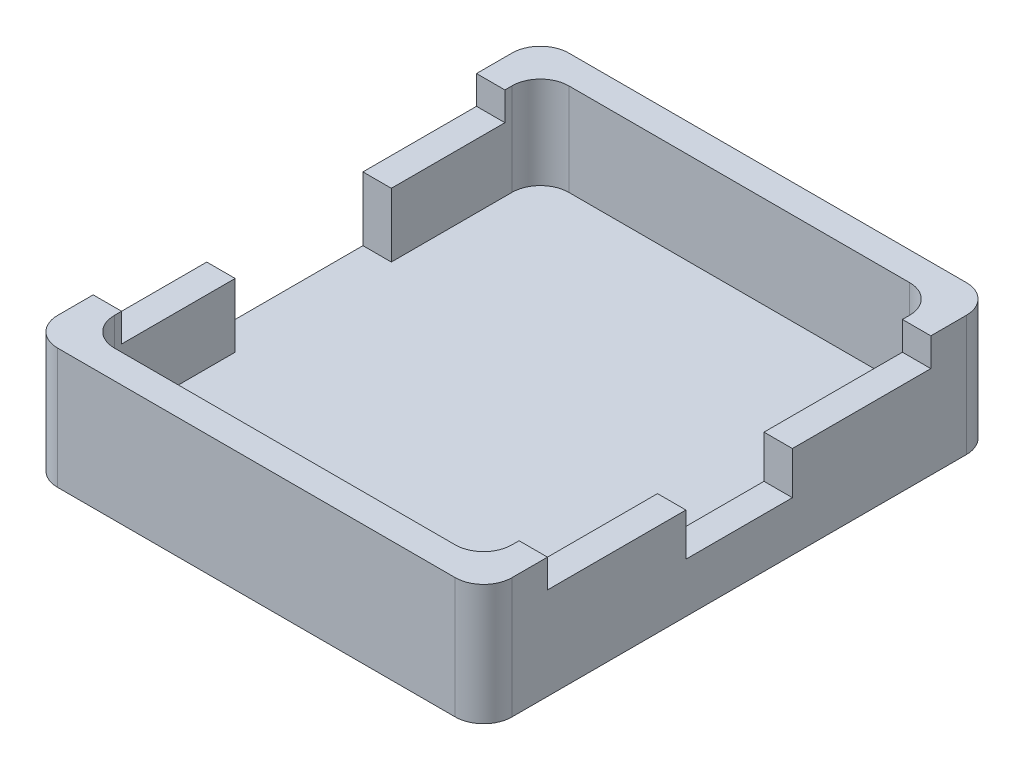
ISO-10303-21;
HEADER;
FILE_DESCRIPTION(('STEP AP214'),'2;1');
FILE_NAME('part.step','',(''),(''),'','','');
FILE_SCHEMA(('AUTOMOTIVE_DESIGN { 1 0 10303 214 1 1 1 1 }'));
ENDSEC;
DATA;
#1=APPLICATION_CONTEXT('core data for automotive mechanical design processes');
#2=APPLICATION_PROTOCOL_DEFINITION('international standard','automotive_design',2000,#1);
#3=PRODUCT_CONTEXT('',#1,'mechanical');
#4=PRODUCT('Part','Part','',(#3));
#5=PRODUCT_RELATED_PRODUCT_CATEGORY('part','',(#4));
#6=PRODUCT_DEFINITION_FORMATION('','',#4);
#7=PRODUCT_DEFINITION_CONTEXT('part definition',#1,'design');
#8=PRODUCT_DEFINITION('design','',#6,#7);
#9=PRODUCT_DEFINITION_SHAPE('','',#8);
#10=(LENGTH_UNIT() NAMED_UNIT(*) SI_UNIT(.MILLI.,.METRE.));
#11=(NAMED_UNIT(*) PLANE_ANGLE_UNIT() SI_UNIT($,.RADIAN.));
#12=(NAMED_UNIT(*) SI_UNIT($,.STERADIAN.) SOLID_ANGLE_UNIT());
#13=UNCERTAINTY_MEASURE_WITH_UNIT(LENGTH_MEASURE(1.E-05),#10,'distance_accuracy_value','');
#14=(GEOMETRIC_REPRESENTATION_CONTEXT(3) GLOBAL_UNCERTAINTY_ASSIGNED_CONTEXT((#13)) GLOBAL_UNIT_ASSIGNED_CONTEXT((#10,
#11,#12)) REPRESENTATION_CONTEXT('',''));
#15=CARTESIAN_POINT('',(0.,0.,0.));
#16=DIRECTION('',(0.,0.,1.));
#17=DIRECTION('',(1.,0.,0.));
#18=AXIS2_PLACEMENT_3D('',#15,#16,#17);
#19=CARTESIAN_POINT('',(0.,8.5,0.));
#20=DIRECTION('',(0.,1.,0.));
#21=DIRECTION('',(0.,0.,1.));
#22=AXIS2_PLACEMENT_3D('',#19,#20,#21);
#23=PLANE('',#22);
#24=DIRECTION('',(0.,0.,1.));
#25=VECTOR('',#24,1.);
#26=CARTESIAN_POINT('',(-16.,8.5,0.));
#27=LINE('',#26,#25);
#28=CARTESIAN_POINT('',(-16.,8.5,13.5));
#29=VERTEX_POINT('',#28);
#30=CARTESIAN_POINT('',(-16.,8.5,16.));
#31=VERTEX_POINT('',#30);
#32=EDGE_CURVE('E434',#29,#31,#27,.T.);
#33=ORIENTED_EDGE('',*,*,#32,.T.);
#34=CARTESIAN_POINT('',(-14.,8.5,16.));
#35=DIRECTION('',(0.,1.,0.));
#36=DIRECTION('',(0.,0.,1.));
#37=AXIS2_PLACEMENT_3D('',#34,#35,#36);
#38=CIRCLE('',#37,2.);
#39=CARTESIAN_POINT('',(-14.,8.5,18.));
#40=VERTEX_POINT('',#39);
#41=EDGE_CURVE('E536',#31,#40,#38,.T.);
#42=ORIENTED_EDGE('',*,*,#41,.T.);
#43=DIRECTION('',(1.,0.,0.));
#44=VECTOR('',#43,1.);
#45=CARTESIAN_POINT('',(0.,8.5,18.));
#46=LINE('',#45,#44);
#47=CARTESIAN_POINT('',(14.,8.5,18.));
#48=VERTEX_POINT('',#47);
#49=EDGE_CURVE('E423',#40,#48,#46,.T.);
#50=ORIENTED_EDGE('',*,*,#49,.T.);
#51=CARTESIAN_POINT('',(14.,8.5,16.));
#52=DIRECTION('',(0.,1.,0.));
#53=DIRECTION('',(0.,0.,1.));
#54=AXIS2_PLACEMENT_3D('',#51,#52,#53);
#55=CIRCLE('',#54,2.);
#56=CARTESIAN_POINT('',(16.,8.5,16.));
#57=VERTEX_POINT('',#56);
#58=EDGE_CURVE('E533',#48,#57,#55,.T.);
#59=ORIENTED_EDGE('',*,*,#58,.T.);
#60=DIRECTION('',(0.,0.,-1.));
#61=VECTOR('',#60,1.);
#62=CARTESIAN_POINT('',(16.,8.5,0.));
#63=LINE('',#62,#61);
#64=CARTESIAN_POINT('',(16.,8.5,13.5));
#65=VERTEX_POINT('',#64);
#66=EDGE_CURVE('E428',#57,#65,#63,.T.);
#67=ORIENTED_EDGE('',*,*,#66,.T.);
#68=DIRECTION('',(1.,0.,0.));
#69=VECTOR('',#68,1.);
#70=CARTESIAN_POINT('',(-13.459060435492,8.5,13.5));
#71=LINE('',#70,#69);
#72=CARTESIAN_POINT('',(14.,8.5,13.5));
#73=VERTEX_POINT('',#72);
#74=EDGE_CURVE('E322',#73,#65,#71,.T.);
#75=ORIENTED_EDGE('',*,*,#74,.F.);
#76=DIRECTION('',(0.,0.,-1.));
#77=VECTOR('',#76,1.);
#78=CARTESIAN_POINT('',(14.,8.5,0.));
#79=LINE('',#78,#77);
#80=CARTESIAN_POINT('',(14.,8.5,14.));
#81=VERTEX_POINT('',#80);
#82=EDGE_CURVE('E285',#81,#73,#79,.T.);
#83=ORIENTED_EDGE('',*,*,#82,.F.);
#84=CARTESIAN_POINT('',(12.,8.5,14.));
#85=DIRECTION('',(0.,1.,0.));
#86=DIRECTION('',(0.,0.,1.));
#87=AXIS2_PLACEMENT_3D('',#84,#85,#86);
#88=CIRCLE('',#87,2.);
#89=CARTESIAN_POINT('',(12.,8.5,16.));
#90=VERTEX_POINT('',#89);
#91=EDGE_CURVE('E11',#81,#90,#88,.F.);
#92=ORIENTED_EDGE('',*,*,#91,.T.);
#93=DIRECTION('',(1.,0.,0.));
#94=VECTOR('',#93,1.);
#95=CARTESIAN_POINT('',(0.,8.5,16.));
#96=LINE('',#95,#94);
#97=CARTESIAN_POINT('',(-12.,8.5,16.));
#98=VERTEX_POINT('',#97);
#99=EDGE_CURVE('E410',#98,#90,#96,.T.);
#100=ORIENTED_EDGE('',*,*,#99,.F.);
#101=CARTESIAN_POINT('',(-12.,8.5,14.));
#102=DIRECTION('',(0.,1.,0.));
#103=DIRECTION('',(0.,0.,1.));
#104=AXIS2_PLACEMENT_3D('',#101,#102,#103);
#105=CIRCLE('',#104,2.);
#106=CARTESIAN_POINT('',(-14.,8.5,14.));
#107=VERTEX_POINT('',#106);
#108=EDGE_CURVE('E557',#98,#107,#105,.F.);
#109=ORIENTED_EDGE('',*,*,#108,.T.);
#110=DIRECTION('',(0.,0.,-1.));
#111=VECTOR('',#110,1.);
#112=CARTESIAN_POINT('',(-14.,8.5,0.));
#113=LINE('',#112,#111);
#114=CARTESIAN_POINT('',(-14.,8.5,13.5));
#115=VERTEX_POINT('',#114);
#116=EDGE_CURVE('E416',#107,#115,#113,.T.);
#117=ORIENTED_EDGE('',*,*,#116,.T.);
#118=DIRECTION('',(-1.,0.,0.));
#119=VECTOR('',#118,1.);
#120=CARTESIAN_POINT('',(13.7713881539976,8.5,13.5));
#121=LINE('',#120,#119);
#122=EDGE_CURVE('E340',#115,#29,#121,.T.);
#123=ORIENTED_EDGE('',*,*,#122,.T.);
#124=EDGE_LOOP('',(#33,#42,#50,#59,#67,#75,#83,#92,#100,#109,#117,#123));
#125=FACE_BOUND('',#124,.T.);
#126=ADVANCED_FACE('F46',(#125),#23,.T.);
#127=CARTESIAN_POINT('',(-14.,8.5,0.));
#128=DIRECTION('',(-1.,0.,0.));
#129=DIRECTION('',(0.,0.,1.));
#130=AXIS2_PLACEMENT_3D('',#127,#128,#129);
#131=PLANE('',#130);
#132=ORIENTED_EDGE('',*,*,#116,.F.);
#133=DIRECTION('',(0.,-1.,0.));
#134=VECTOR('',#133,1.);
#135=CARTESIAN_POINT('',(-14.,8.5,14.));
#136=LINE('',#135,#134);
#137=CARTESIAN_POINT('',(-14.,2.,14.));
#138=VERTEX_POINT('',#137);
#139=EDGE_CURVE('E467',#107,#138,#136,.T.);
#140=ORIENTED_EDGE('',*,*,#139,.T.);
#141=DIRECTION('',(0.,0.,-1.));
#142=VECTOR('',#141,1.);
#143=CARTESIAN_POINT('',(-14.,2.,0.));
#144=LINE('',#143,#142);
#145=CARTESIAN_POINT('',(-14.,2.,5.49999999999999));
#146=VERTEX_POINT('',#145);
#147=EDGE_CURVE('E447',#138,#146,#144,.T.);
#148=ORIENTED_EDGE('',*,*,#147,.T.);
#149=DIRECTION('',(0.,-1.,0.));
#150=VECTOR('',#149,1.);
#151=CARTESIAN_POINT('',(-14.,6.5,5.49999999999999));
#152=LINE('',#151,#150);
#153=CARTESIAN_POINT('',(-14.,6.5,5.49999999999999));
#154=VERTEX_POINT('',#153);
#155=EDGE_CURVE('E343',#154,#146,#152,.T.);
#156=ORIENTED_EDGE('',*,*,#155,.F.);
#157=DIRECTION('',(0.,0.,-1.));
#158=VECTOR('',#157,1.);
#159=CARTESIAN_POINT('',(-14.,6.5,13.5));
#160=LINE('',#159,#158);
#161=CARTESIAN_POINT('',(-14.,6.5,13.5));
#162=VERTEX_POINT('',#161);
#163=EDGE_CURVE('E347',#162,#154,#160,.T.);
#164=ORIENTED_EDGE('',*,*,#163,.F.);
#165=DIRECTION('',(0.,-1.,0.));
#166=VECTOR('',#165,1.);
#167=CARTESIAN_POINT('',(-14.,8.5,13.5));
#168=LINE('',#167,#166);
#169=EDGE_CURVE('E350',#115,#162,#168,.T.);
#170=ORIENTED_EDGE('',*,*,#169,.F.);
#171=EDGE_LOOP('',(#132,#140,#148,#156,#164,#170));
#172=FACE_BOUND('',#171,.T.);
#173=ADVANCED_FACE('F639',(#172),#131,.F.);
#174=CARTESIAN_POINT('',(16.,2.,18.));
#175=DIRECTION('',(-1.,0.,0.));
#176=DIRECTION('',(0.,0.,1.));
#177=AXIS2_PLACEMENT_3D('',#174,#175,#176);
#178=PLANE('',#177);
#179=DIRECTION('',(0.,0.,-1.));
#180=VECTOR('',#179,1.);
#181=CARTESIAN_POINT('',(16.,0.,18.));
#182=LINE('',#181,#180);
#183=CARTESIAN_POINT('',(16.,0.,16.));
#184=VERTEX_POINT('',#183);
#185=CARTESIAN_POINT('',(16.,0.,-16.));
#186=VERTEX_POINT('',#185);
#187=EDGE_CURVE('E438',#184,#186,#182,.T.);
#188=ORIENTED_EDGE('',*,*,#187,.T.);
#189=DIRECTION('',(0.,-1.,0.));
#190=VECTOR('',#189,1.);
#191=CARTESIAN_POINT('',(16.,2.,-16.));
#192=LINE('',#191,#190);
#193=CARTESIAN_POINT('',(16.,8.5,-16.));
#194=VERTEX_POINT('',#193);
#195=EDGE_CURVE('E62',#186,#194,#192,.F.);
#196=ORIENTED_EDGE('',*,*,#195,.T.);
#197=CARTESIAN_POINT('',(16.,8.5,-13.5));
#198=VERTEX_POINT('',#197);
#199=EDGE_CURVE('E427',#198,#194,#63,.T.);
#200=ORIENTED_EDGE('',*,*,#199,.F.);
#201=DIRECTION('',(0.,1.,0.));
#202=VECTOR('',#201,1.);
#203=CARTESIAN_POINT('',(16.,8.5,-13.5));
#204=LINE('',#203,#202);
#205=CARTESIAN_POINT('',(16.,6.5,-13.5));
#206=VERTEX_POINT('',#205);
#207=EDGE_CURVE('E287',#206,#198,#204,.T.);
#208=ORIENTED_EDGE('',*,*,#207,.F.);
#209=DIRECTION('',(0.,0.,-1.));
#210=VECTOR('',#209,1.);
#211=CARTESIAN_POINT('',(16.,6.5,-13.5));
#212=LINE('',#211,#210);
#213=CARTESIAN_POINT('',(16.,6.5,-3.75));
#214=VERTEX_POINT('',#213);
#215=EDGE_CURVE('E290',#214,#206,#212,.T.);
#216=ORIENTED_EDGE('',*,*,#215,.F.);
#217=DIRECTION('',(0.,1.,0.));
#218=VECTOR('',#217,1.);
#219=CARTESIAN_POINT('',(16.,6.5,-3.75));
#220=LINE('',#219,#218);
#221=CARTESIAN_POINT('',(16.,3.5,-3.75));
#222=VERTEX_POINT('',#221);
#223=EDGE_CURVE('E691',#222,#214,#220,.T.);
#224=ORIENTED_EDGE('',*,*,#223,.F.);
#225=DIRECTION('',(0.,0.,-1.));
#226=VECTOR('',#225,1.);
#227=CARTESIAN_POINT('',(16.,3.5,3.75));
#228=LINE('',#227,#226);
#229=CARTESIAN_POINT('',(16.,3.5,3.75));
#230=VERTEX_POINT('',#229);
#231=EDGE_CURVE('E694',#230,#222,#228,.T.);
#232=ORIENTED_EDGE('',*,*,#231,.F.);
#233=DIRECTION('',(0.,-1.,0.));
#234=VECTOR('',#233,1.);
#235=CARTESIAN_POINT('',(16.,6.5,3.75));
#236=LINE('',#235,#234);
#237=CARTESIAN_POINT('',(16.,6.5,3.75));
#238=VERTEX_POINT('',#237);
#239=EDGE_CURVE('E700',#238,#230,#236,.T.);
#240=ORIENTED_EDGE('',*,*,#239,.F.);
#241=DIRECTION('',(0.,0.,-1.));
#242=VECTOR('',#241,1.);
#243=CARTESIAN_POINT('',(16.,6.5,13.5));
#244=LINE('',#243,#242);
#245=CARTESIAN_POINT('',(16.,6.5,13.5));
#246=VERTEX_POINT('',#245);
#247=EDGE_CURVE('E703',#246,#238,#244,.T.);
#248=ORIENTED_EDGE('',*,*,#247,.F.);
#249=DIRECTION('',(0.,-1.,0.));
#250=VECTOR('',#249,1.);
#251=CARTESIAN_POINT('',(16.,8.5,13.5));
#252=LINE('',#251,#250);
#253=EDGE_CURVE('E278',#65,#246,#252,.T.);
#254=ORIENTED_EDGE('',*,*,#253,.F.);
#255=ORIENTED_EDGE('',*,*,#66,.F.);
#256=DIRECTION('',(0.,-1.,0.));
#257=VECTOR('',#256,1.);
#258=CARTESIAN_POINT('',(16.,2.,16.));
#259=LINE('',#258,#257);
#260=EDGE_CURVE('E551',#57,#184,#259,.T.);
#261=ORIENTED_EDGE('',*,*,#260,.T.);
#262=EDGE_LOOP('',(#188,#196,#200,#208,#216,#224,#232,#240,#248,#254,#255,#261));
#263=FACE_BOUND('',#262,.T.);
#264=ADVANCED_FACE('F621',(#263),#178,.F.);
#265=CARTESIAN_POINT('',(-16.,2.,-18.));
#266=DIRECTION('',(0.,0.,1.));
#267=DIRECTION('',(1.,0.,0.));
#268=AXIS2_PLACEMENT_3D('',#265,#266,#267);
#269=PLANE('',#268);
#270=DIRECTION('',(-1.,0.,0.));
#271=VECTOR('',#270,1.);
#272=CARTESIAN_POINT('',(-16.,0.,-18.));
#273=LINE('',#272,#271);
#274=CARTESIAN_POINT('',(14.,0.,-18.));
#275=VERTEX_POINT('',#274);
#276=CARTESIAN_POINT('',(-14.,0.,-18.));
#277=VERTEX_POINT('',#276);
#278=EDGE_CURVE('E456',#275,#277,#273,.T.);
#279=ORIENTED_EDGE('',*,*,#278,.T.);
#280=DIRECTION('',(0.,-1.,0.));
#281=VECTOR('',#280,1.);
#282=CARTESIAN_POINT('',(-14.,2.,-18.));
#283=LINE('',#282,#281);
#284=CARTESIAN_POINT('',(-14.,8.5,-18.));
#285=VERTEX_POINT('',#284);
#286=EDGE_CURVE('E70',#277,#285,#283,.F.);
#287=ORIENTED_EDGE('',*,*,#286,.T.);
#288=DIRECTION('',(-1.,0.,0.));
#289=VECTOR('',#288,1.);
#290=CARTESIAN_POINT('',(0.,8.5,-18.));
#291=LINE('',#290,#289);
#292=CARTESIAN_POINT('',(14.,8.5,-18.));
#293=VERTEX_POINT('',#292);
#294=EDGE_CURVE('E431',#293,#285,#291,.T.);
#295=ORIENTED_EDGE('',*,*,#294,.F.);
#296=DIRECTION('',(0.,-1.,0.));
#297=VECTOR('',#296,1.);
#298=CARTESIAN_POINT('',(14.,2.,-18.));
#299=LINE('',#298,#297);
#300=EDGE_CURVE('E539',#293,#275,#299,.T.);
#301=ORIENTED_EDGE('',*,*,#300,.T.);
#302=EDGE_LOOP('',(#279,#287,#295,#301));
#303=FACE_BOUND('',#302,.T.);
#304=ADVANCED_FACE('F674',(#303),#269,.F.);
#305=CARTESIAN_POINT('',(-16.,2.,18.));
#306=DIRECTION('',(1.,0.,0.));
#307=DIRECTION('',(0.,0.,-1.));
#308=AXIS2_PLACEMENT_3D('',#305,#306,#307);
#309=PLANE('',#308);
#310=DIRECTION('',(0.,0.,1.));
#311=VECTOR('',#310,1.);
#312=CARTESIAN_POINT('',(-16.,0.,18.));
#313=LINE('',#312,#311);
#314=CARTESIAN_POINT('',(-16.,0.,-16.));
#315=VERTEX_POINT('',#314);
#316=CARTESIAN_POINT('',(-16.,0.,16.));
#317=VERTEX_POINT('',#316);
#318=EDGE_CURVE('E459',#315,#317,#313,.T.);
#319=ORIENTED_EDGE('',*,*,#318,.T.);
#320=DIRECTION('',(0.,-1.,0.));
#321=VECTOR('',#320,1.);
#322=CARTESIAN_POINT('',(-16.,2.,16.));
#323=LINE('',#322,#321);
#324=EDGE_CURVE('E530',#317,#31,#323,.F.);
#325=ORIENTED_EDGE('',*,*,#324,.T.);
#326=ORIENTED_EDGE('',*,*,#32,.F.);
#327=DIRECTION('',(0.,1.,0.));
#328=VECTOR('',#327,1.);
#329=CARTESIAN_POINT('',(-16.,8.5,13.5));
#330=LINE('',#329,#328);
#331=CARTESIAN_POINT('',(-16.,6.5,13.5));
#332=VERTEX_POINT('',#331);
#333=EDGE_CURVE('E377',#332,#29,#330,.T.);
#334=ORIENTED_EDGE('',*,*,#333,.F.);
#335=DIRECTION('',(0.,0.,1.));
#336=VECTOR('',#335,1.);
#337=CARTESIAN_POINT('',(-16.,6.5,13.5));
#338=LINE('',#337,#336);
#339=CARTESIAN_POINT('',(-16.,6.5,5.49999999999999));
#340=VERTEX_POINT('',#339);
#341=EDGE_CURVE('E373',#340,#332,#338,.T.);
#342=ORIENTED_EDGE('',*,*,#341,.F.);
#343=DIRECTION('',(0.,1.,0.));
#344=VECTOR('',#343,1.);
#345=CARTESIAN_POINT('',(-16.,6.5,5.49999999999999));
#346=LINE('',#345,#344);
#347=CARTESIAN_POINT('',(-16.,2.,5.49999999999999));
#348=VERTEX_POINT('',#347);
#349=EDGE_CURVE('E369',#348,#340,#346,.T.);
#350=ORIENTED_EDGE('',*,*,#349,.F.);
#351=DIRECTION('',(0.,0.,1.));
#352=VECTOR('',#351,1.);
#353=CARTESIAN_POINT('',(-16.,2.,-5.50000000000001));
#354=LINE('',#353,#352);
#355=CARTESIAN_POINT('',(-16.,2.,-5.50000000000001));
#356=VERTEX_POINT('',#355);
#357=EDGE_CURVE('E365',#356,#348,#354,.T.);
#358=ORIENTED_EDGE('',*,*,#357,.F.);
#359=DIRECTION('',(0.,-1.,0.));
#360=VECTOR('',#359,1.);
#361=CARTESIAN_POINT('',(-16.,6.5,-5.50000000000001));
#362=LINE('',#361,#360);
#363=CARTESIAN_POINT('',(-16.,6.5,-5.50000000000001));
#364=VERTEX_POINT('',#363);
#365=EDGE_CURVE('E361',#364,#356,#362,.T.);
#366=ORIENTED_EDGE('',*,*,#365,.F.);
#367=DIRECTION('',(0.,0.,1.));
#368=VECTOR('',#367,1.);
#369=CARTESIAN_POINT('',(-16.,6.5,-13.5));
#370=LINE('',#369,#368);
#371=CARTESIAN_POINT('',(-16.,6.5,-13.5));
#372=VERTEX_POINT('',#371);
#373=EDGE_CURVE('E357',#372,#364,#370,.T.);
#374=ORIENTED_EDGE('',*,*,#373,.F.);
#375=DIRECTION('',(0.,-1.,0.));
#376=VECTOR('',#375,1.);
#377=CARTESIAN_POINT('',(-16.,8.5,-13.5));
#378=LINE('',#377,#376);
#379=CARTESIAN_POINT('',(-16.,8.5,-13.5));
#380=VERTEX_POINT('',#379);
#381=EDGE_CURVE('E335',#380,#372,#378,.T.);
#382=ORIENTED_EDGE('',*,*,#381,.F.);
#383=CARTESIAN_POINT('',(-16.,8.5,-16.));
#384=VERTEX_POINT('',#383);
#385=EDGE_CURVE('E435',#384,#380,#27,.T.);
#386=ORIENTED_EDGE('',*,*,#385,.F.);
#387=DIRECTION('',(0.,-1.,0.));
#388=VECTOR('',#387,1.);
#389=CARTESIAN_POINT('',(-16.,2.,-16.));
#390=LINE('',#389,#388);
#391=EDGE_CURVE('E526',#384,#315,#390,.T.);
#392=ORIENTED_EDGE('',*,*,#391,.T.);
#393=EDGE_LOOP('',(#319,#325,#326,#334,#342,#350,#358,#366,#374,#382,#386,#392));
#394=FACE_BOUND('',#393,.T.);
#395=ADVANCED_FACE('F647',(#394),#309,.F.);
#396=CARTESIAN_POINT('',(-16.,2.,18.));
#397=DIRECTION('',(0.,0.,-1.));
#398=DIRECTION('',(-1.,0.,0.));
#399=AXIS2_PLACEMENT_3D('',#396,#397,#398);
#400=PLANE('',#399);
#401=ORIENTED_EDGE('',*,*,#49,.F.);
#402=DIRECTION('',(0.,-1.,0.));
#403=VECTOR('',#402,1.);
#404=CARTESIAN_POINT('',(-14.,2.,18.));
#405=LINE('',#404,#403);
#406=CARTESIAN_POINT('',(-14.,0.,18.));
#407=VERTEX_POINT('',#406);
#408=EDGE_CURVE('E510',#40,#407,#405,.T.);
#409=ORIENTED_EDGE('',*,*,#408,.T.);
#410=DIRECTION('',(1.,0.,0.));
#411=VECTOR('',#410,1.);
#412=CARTESIAN_POINT('',(-16.,0.,18.));
#413=LINE('',#412,#411);
#414=CARTESIAN_POINT('',(14.,0.,18.));
#415=VERTEX_POINT('',#414);
#416=EDGE_CURVE('E463',#407,#415,#413,.T.);
#417=ORIENTED_EDGE('',*,*,#416,.T.);
#418=DIRECTION('',(0.,-1.,0.));
#419=VECTOR('',#418,1.);
#420=CARTESIAN_POINT('',(14.,2.,18.));
#421=LINE('',#420,#419);
#422=EDGE_CURVE('E507',#415,#48,#421,.F.);
#423=ORIENTED_EDGE('',*,*,#422,.T.);
#424=EDGE_LOOP('',(#401,#409,#417,#423));
#425=FACE_BOUND('',#424,.T.);
#426=ADVANCED_FACE('F611',(#425),#400,.F.);
#427=CARTESIAN_POINT('',(0.,0.,0.));
#428=DIRECTION('',(0.,-1.,0.));
#429=DIRECTION('',(0.,0.,-1.));
#430=AXIS2_PLACEMENT_3D('',#427,#428,#429);
#431=PLANE('',#430);
#432=ORIENTED_EDGE('',*,*,#416,.F.);
#433=CARTESIAN_POINT('',(-14.,0.,16.));
#434=DIRECTION('',(0.,-1.,0.));
#435=DIRECTION('',(0.,0.,-1.));
#436=AXIS2_PLACEMENT_3D('',#433,#434,#435);
#437=CIRCLE('',#436,2.);
#438=EDGE_CURVE('E523',#407,#317,#437,.T.);
#439=ORIENTED_EDGE('',*,*,#438,.T.);
#440=ORIENTED_EDGE('',*,*,#318,.F.);
#441=CARTESIAN_POINT('',(-14.,0.,-16.));
#442=DIRECTION('',(0.,-1.,0.));
#443=DIRECTION('',(0.,0.,-1.));
#444=AXIS2_PLACEMENT_3D('',#441,#442,#443);
#445=CIRCLE('',#444,2.);
#446=EDGE_CURVE('E520',#315,#277,#445,.T.);
#447=ORIENTED_EDGE('',*,*,#446,.T.);
#448=ORIENTED_EDGE('',*,*,#278,.F.);
#449=CARTESIAN_POINT('',(14.,0.,-16.));
#450=DIRECTION('',(0.,-1.,0.));
#451=DIRECTION('',(0.,0.,-1.));
#452=AXIS2_PLACEMENT_3D('',#449,#450,#451);
#453=CIRCLE('',#452,2.);
#454=EDGE_CURVE('E517',#275,#186,#453,.T.);
#455=ORIENTED_EDGE('',*,*,#454,.T.);
#456=ORIENTED_EDGE('',*,*,#187,.F.);
#457=CARTESIAN_POINT('',(14.,0.,16.));
#458=DIRECTION('',(0.,-1.,0.));
#459=DIRECTION('',(0.,0.,-1.));
#460=AXIS2_PLACEMENT_3D('',#457,#458,#459);
#461=CIRCLE('',#460,2.);
#462=EDGE_CURVE('E514',#184,#415,#461,.T.);
#463=ORIENTED_EDGE('',*,*,#462,.T.);
#464=EDGE_LOOP('',(#432,#439,#440,#447,#448,#455,#456,#463));
#465=FACE_BOUND('',#464,.T.);
#466=ADVANCED_FACE('F614',(#465),#431,.T.);
#467=CARTESIAN_POINT('',(14.,8.5,0.));
#468=DIRECTION('',(-1.,0.,0.));
#469=DIRECTION('',(0.,0.,1.));
#470=AXIS2_PLACEMENT_3D('',#467,#468,#469);
#471=PLANE('',#470);
#472=CARTESIAN_POINT('',(14.,8.5,-13.5));
#473=VERTEX_POINT('',#472);
#474=CARTESIAN_POINT('',(14.,8.5,-14.));
#475=VERTEX_POINT('',#474);
#476=EDGE_CURVE('E411',#473,#475,#79,.T.);
#477=ORIENTED_EDGE('',*,*,#476,.T.);
#478=DIRECTION('',(0.,-1.,0.));
#479=VECTOR('',#478,1.);
#480=CARTESIAN_POINT('',(14.,8.5,-14.));
#481=LINE('',#480,#479);
#482=CARTESIAN_POINT('',(14.,2.,-14.));
#483=VERTEX_POINT('',#482);
#484=EDGE_CURVE('E503',#475,#483,#481,.T.);
#485=ORIENTED_EDGE('',*,*,#484,.T.);
#486=DIRECTION('',(0.,0.,-1.));
#487=VECTOR('',#486,1.);
#488=CARTESIAN_POINT('',(14.,2.,0.));
#489=LINE('',#488,#487);
#490=CARTESIAN_POINT('',(14.,2.,14.));
#491=VERTEX_POINT('',#490);
#492=EDGE_CURVE('E407',#491,#483,#489,.T.);
#493=ORIENTED_EDGE('',*,*,#492,.F.);
#494=DIRECTION('',(0.,-1.,0.));
#495=VECTOR('',#494,1.);
#496=CARTESIAN_POINT('',(14.,8.5,14.));
#497=LINE('',#496,#495);
#498=EDGE_CURVE('E500',#491,#81,#497,.F.);
#499=ORIENTED_EDGE('',*,*,#498,.T.);
#500=ORIENTED_EDGE('',*,*,#82,.T.);
#501=DIRECTION('',(0.,-1.,0.));
#502=VECTOR('',#501,1.);
#503=CARTESIAN_POINT('',(14.,8.5,13.5));
#504=LINE('',#503,#502);
#505=CARTESIAN_POINT('',(14.,6.5,13.5));
#506=VERTEX_POINT('',#505);
#507=EDGE_CURVE('E275',#73,#506,#504,.T.);
#508=ORIENTED_EDGE('',*,*,#507,.T.);
#509=DIRECTION('',(0.,0.,-1.));
#510=VECTOR('',#509,1.);
#511=CARTESIAN_POINT('',(14.,6.5,13.5));
#512=LINE('',#511,#510);
#513=CARTESIAN_POINT('',(14.,6.5,3.75));
#514=VERTEX_POINT('',#513);
#515=EDGE_CURVE('E259',#506,#514,#512,.T.);
#516=ORIENTED_EDGE('',*,*,#515,.T.);
#517=DIRECTION('',(0.,-1.,0.));
#518=VECTOR('',#517,1.);
#519=CARTESIAN_POINT('',(14.,6.5,3.75));
#520=LINE('',#519,#518);
#521=CARTESIAN_POINT('',(14.,3.5,3.75));
#522=VERTEX_POINT('',#521);
#523=EDGE_CURVE('E316',#514,#522,#520,.T.);
#524=ORIENTED_EDGE('',*,*,#523,.T.);
#525=DIRECTION('',(0.,0.,-1.));
#526=VECTOR('',#525,1.);
#527=CARTESIAN_POINT('',(14.,3.5,3.75));
#528=LINE('',#527,#526);
#529=CARTESIAN_POINT('',(14.,3.5,-3.75));
#530=VERTEX_POINT('',#529);
#531=EDGE_CURVE('E311',#522,#530,#528,.T.);
#532=ORIENTED_EDGE('',*,*,#531,.T.);
#533=DIRECTION('',(0.,1.,0.));
#534=VECTOR('',#533,1.);
#535=CARTESIAN_POINT('',(14.,6.5,-3.75));
#536=LINE('',#535,#534);
#537=CARTESIAN_POINT('',(14.,6.5,-3.75));
#538=VERTEX_POINT('',#537);
#539=EDGE_CURVE('E306',#530,#538,#536,.T.);
#540=ORIENTED_EDGE('',*,*,#539,.T.);
#541=DIRECTION('',(0.,0.,-1.));
#542=VECTOR('',#541,1.);
#543=CARTESIAN_POINT('',(14.,6.5,-13.5));
#544=LINE('',#543,#542);
#545=CARTESIAN_POINT('',(14.,6.5,-13.5));
#546=VERTEX_POINT('',#545);
#547=EDGE_CURVE('E301',#538,#546,#544,.T.);
#548=ORIENTED_EDGE('',*,*,#547,.T.);
#549=DIRECTION('',(0.,1.,0.));
#550=VECTOR('',#549,1.);
#551=CARTESIAN_POINT('',(14.,8.5,-13.5));
#552=LINE('',#551,#550);
#553=EDGE_CURVE('E295',#546,#473,#552,.T.);
#554=ORIENTED_EDGE('',*,*,#553,.T.);
#555=EDGE_LOOP('',(#477,#485,#493,#499,#500,#508,#516,#524,#532,#540,#548,#554));
#556=FACE_BOUND('',#555,.T.);
#557=ADVANCED_FACE('F283',(#556),#471,.T.);
#558=CARTESIAN_POINT('',(0.,8.5,16.));
#559=DIRECTION('',(0.,0.,-1.));
#560=DIRECTION('',(-1.,0.,0.));
#561=AXIS2_PLACEMENT_3D('',#558,#559,#560);
#562=PLANE('',#561);
#563=DIRECTION('',(1.,0.,0.));
#564=VECTOR('',#563,1.);
#565=CARTESIAN_POINT('',(0.,2.,16.));
#566=LINE('',#565,#564);
#567=CARTESIAN_POINT('',(-12.,2.,16.));
#568=VERTEX_POINT('',#567);
#569=CARTESIAN_POINT('',(12.,2.,16.));
#570=VERTEX_POINT('',#569);
#571=EDGE_CURVE('E442',#568,#570,#566,.T.);
#572=ORIENTED_EDGE('',*,*,#571,.F.);
#573=DIRECTION('',(0.,-1.,0.));
#574=VECTOR('',#573,1.);
#575=CARTESIAN_POINT('',(-12.,8.5,16.));
#576=LINE('',#575,#574);
#577=EDGE_CURVE('E487',#568,#98,#576,.F.);
#578=ORIENTED_EDGE('',*,*,#577,.T.);
#579=ORIENTED_EDGE('',*,*,#99,.T.);
#580=DIRECTION('',(0.,-1.,0.));
#581=VECTOR('',#580,1.);
#582=CARTESIAN_POINT('',(12.,2.,16.));
#583=LINE('',#582,#581);
#584=EDGE_CURVE('E483',#90,#570,#583,.T.);
#585=ORIENTED_EDGE('',*,*,#584,.T.);
#586=EDGE_LOOP('',(#572,#578,#579,#585));
#587=FACE_BOUND('',#586,.T.);
#588=ADVANCED_FACE('F630',(#587),#562,.T.);
#589=CARTESIAN_POINT('',(-14.,2.,-5.5));
#590=VERTEX_POINT('',#589);
#591=CARTESIAN_POINT('',(-14.,2.,-14.));
#592=VERTEX_POINT('',#591);
#593=EDGE_CURVE('E446',#590,#592,#144,.T.);
#594=ORIENTED_EDGE('',*,*,#593,.T.);
#595=DIRECTION('',(0.,-1.,0.));
#596=VECTOR('',#595,1.);
#597=CARTESIAN_POINT('',(-14.,8.5,-14.));
#598=LINE('',#597,#596);
#599=CARTESIAN_POINT('',(-14.,8.5,-14.));
#600=VERTEX_POINT('',#599);
#601=EDGE_CURVE('E497',#592,#600,#598,.F.);
#602=ORIENTED_EDGE('',*,*,#601,.T.);
#603=CARTESIAN_POINT('',(-14.,8.5,-13.5));
#604=VERTEX_POINT('',#603);
#605=EDGE_CURVE('E415',#604,#600,#113,.T.);
#606=ORIENTED_EDGE('',*,*,#605,.F.);
#607=DIRECTION('',(0.,1.,0.));
#608=VECTOR('',#607,1.);
#609=CARTESIAN_POINT('',(-14.,8.5,-13.5));
#610=LINE('',#609,#608);
#611=CARTESIAN_POINT('',(-14.,6.5,-13.5));
#612=VERTEX_POINT('',#611);
#613=EDGE_CURVE('E353',#612,#604,#610,.T.);
#614=ORIENTED_EDGE('',*,*,#613,.F.);
#615=DIRECTION('',(0.,0.,-1.));
#616=VECTOR('',#615,1.);
#617=CARTESIAN_POINT('',(-14.,6.5,-13.5));
#618=LINE('',#617,#616);
#619=CARTESIAN_POINT('',(-14.,6.5,-5.49999999999999));
#620=VERTEX_POINT('',#619);
#621=EDGE_CURVE('E336',#620,#612,#618,.T.);
#622=ORIENTED_EDGE('',*,*,#621,.F.);
#623=DIRECTION('',(0.,1.,0.));
#624=VECTOR('',#623,1.);
#625=CARTESIAN_POINT('',(-14.,6.5,-5.50000000000001));
#626=LINE('',#625,#624);
#627=EDGE_CURVE('E339',#590,#620,#626,.T.);
#628=ORIENTED_EDGE('',*,*,#627,.F.);
#629=EDGE_LOOP('',(#594,#602,#606,#614,#622,#628));
#630=FACE_BOUND('',#629,.T.);
#631=ADVANCED_FACE('F589',(#630),#131,.F.);
#632=CARTESIAN_POINT('',(0.,8.5,-16.));
#633=DIRECTION('',(0.,0.,-1.));
#634=DIRECTION('',(-1.,0.,0.));
#635=AXIS2_PLACEMENT_3D('',#632,#633,#634);
#636=PLANE('',#635);
#637=DIRECTION('',(1.,0.,0.));
#638=VECTOR('',#637,1.);
#639=CARTESIAN_POINT('',(0.,8.5,-16.));
#640=LINE('',#639,#638);
#641=CARTESIAN_POINT('',(-12.,8.5,-16.));
#642=VERTEX_POINT('',#641);
#643=CARTESIAN_POINT('',(12.,8.5,-16.));
#644=VERTEX_POINT('',#643);
#645=EDGE_CURVE('E419',#642,#644,#640,.T.);
#646=ORIENTED_EDGE('',*,*,#645,.F.);
#647=DIRECTION('',(0.,-1.,0.));
#648=VECTOR('',#647,1.);
#649=CARTESIAN_POINT('',(-12.,2.,-16.));
#650=LINE('',#649,#648);
#651=CARTESIAN_POINT('',(-12.,2.,-16.));
#652=VERTEX_POINT('',#651);
#653=EDGE_CURVE('E493',#642,#652,#650,.T.);
#654=ORIENTED_EDGE('',*,*,#653,.T.);
#655=DIRECTION('',(1.,0.,0.));
#656=VECTOR('',#655,1.);
#657=CARTESIAN_POINT('',(0.,2.,-16.));
#658=LINE('',#657,#656);
#659=CARTESIAN_POINT('',(12.,2.,-16.));
#660=VERTEX_POINT('',#659);
#661=EDGE_CURVE('E450',#652,#660,#658,.T.);
#662=ORIENTED_EDGE('',*,*,#661,.T.);
#663=DIRECTION('',(0.,-1.,0.));
#664=VECTOR('',#663,1.);
#665=CARTESIAN_POINT('',(12.,8.5,-16.));
#666=LINE('',#665,#664);
#667=EDGE_CURVE('E490',#660,#644,#666,.F.);
#668=ORIENTED_EDGE('',*,*,#667,.T.);
#669=EDGE_LOOP('',(#646,#654,#662,#668));
#670=FACE_BOUND('',#669,.T.);
#671=ADVANCED_FACE('F579',(#670),#636,.F.);
#672=ORIENTED_EDGE('',*,*,#294,.T.);
#673=CARTESIAN_POINT('',(-14.,8.5,-16.));
#674=DIRECTION('',(0.,1.,0.));
#675=DIRECTION('',(0.,0.,1.));
#676=AXIS2_PLACEMENT_3D('',#673,#674,#675);
#677=CIRCLE('',#676,2.);
#678=EDGE_CURVE('E548',#285,#384,#677,.T.);
#679=ORIENTED_EDGE('',*,*,#678,.T.);
#680=ORIENTED_EDGE('',*,*,#385,.T.);
#681=DIRECTION('',(-1.,0.,0.));
#682=VECTOR('',#681,1.);
#683=CARTESIAN_POINT('',(13.7713881539976,8.5,-13.5));
#684=LINE('',#683,#682);
#685=EDGE_CURVE('E380',#604,#380,#684,.T.);
#686=ORIENTED_EDGE('',*,*,#685,.F.);
#687=ORIENTED_EDGE('',*,*,#605,.T.);
#688=CARTESIAN_POINT('',(-12.,8.5,-14.));
#689=DIRECTION('',(0.,1.,0.));
#690=DIRECTION('',(0.,0.,1.));
#691=AXIS2_PLACEMENT_3D('',#688,#689,#690);
#692=CIRCLE('',#691,2.);
#693=EDGE_CURVE('E560',#600,#642,#692,.F.);
#694=ORIENTED_EDGE('',*,*,#693,.T.);
#695=ORIENTED_EDGE('',*,*,#645,.T.);
#696=CARTESIAN_POINT('',(12.,8.5,-14.));
#697=DIRECTION('',(0.,1.,0.));
#698=DIRECTION('',(0.,0.,1.));
#699=AXIS2_PLACEMENT_3D('',#696,#697,#698);
#700=CIRCLE('',#699,2.);
#701=EDGE_CURVE('E55',#644,#475,#700,.F.);
#702=ORIENTED_EDGE('',*,*,#701,.T.);
#703=ORIENTED_EDGE('',*,*,#476,.F.);
#704=DIRECTION('',(1.,0.,0.));
#705=VECTOR('',#704,1.);
#706=CARTESIAN_POINT('',(-13.459060435492,8.5,-13.5));
#707=LINE('',#706,#705);
#708=EDGE_CURVE('E299',#473,#198,#707,.T.);
#709=ORIENTED_EDGE('',*,*,#708,.T.);
#710=ORIENTED_EDGE('',*,*,#199,.T.);
#711=CARTESIAN_POINT('',(14.,8.5,-16.));
#712=DIRECTION('',(0.,1.,0.));
#713=DIRECTION('',(0.,0.,1.));
#714=AXIS2_PLACEMENT_3D('',#711,#712,#713);
#715=CIRCLE('',#714,2.);
#716=EDGE_CURVE('E545',#194,#293,#715,.T.);
#717=ORIENTED_EDGE('',*,*,#716,.T.);
#718=EDGE_LOOP('',(#672,#679,#680,#686,#687,#694,#695,#702,#703,#709,#710,#717));
#719=FACE_BOUND('',#718,.T.);
#720=ADVANCED_FACE('F566',(#719),#23,.T.);
#721=CARTESIAN_POINT('',(0.,2.,0.));
#722=DIRECTION('',(0.,-1.,0.));
#723=DIRECTION('',(0.,0.,-1.));
#724=AXIS2_PLACEMENT_3D('',#721,#722,#723);
#725=PLANE('',#724);
#726=ORIENTED_EDGE('',*,*,#147,.F.);
#727=CARTESIAN_POINT('',(-12.,2.,14.));
#728=DIRECTION('',(0.,-1.,0.));
#729=DIRECTION('',(0.,0.,-1.));
#730=AXIS2_PLACEMENT_3D('',#727,#728,#729);
#731=CIRCLE('',#730,2.);
#732=EDGE_CURVE('E480',#138,#568,#731,.F.);
#733=ORIENTED_EDGE('',*,*,#732,.T.);
#734=ORIENTED_EDGE('',*,*,#571,.T.);
#735=CARTESIAN_POINT('',(12.,2.,14.));
#736=DIRECTION('',(0.,-1.,0.));
#737=DIRECTION('',(0.,0.,-1.));
#738=AXIS2_PLACEMENT_3D('',#735,#736,#737);
#739=CIRCLE('',#738,2.);
#740=EDGE_CURVE('E471',#570,#491,#739,.F.);
#741=ORIENTED_EDGE('',*,*,#740,.T.);
#742=ORIENTED_EDGE('',*,*,#492,.T.);
#743=CARTESIAN_POINT('',(12.,2.,-14.));
#744=DIRECTION('',(0.,-1.,0.));
#745=DIRECTION('',(0.,0.,-1.));
#746=AXIS2_PLACEMENT_3D('',#743,#744,#745);
#747=CIRCLE('',#746,2.);
#748=EDGE_CURVE('E474',#483,#660,#747,.F.);
#749=ORIENTED_EDGE('',*,*,#748,.T.);
#750=ORIENTED_EDGE('',*,*,#661,.F.);
#751=CARTESIAN_POINT('',(-12.,2.,-14.));
#752=DIRECTION('',(0.,-1.,0.));
#753=DIRECTION('',(0.,0.,-1.));
#754=AXIS2_PLACEMENT_3D('',#751,#752,#753);
#755=CIRCLE('',#754,2.);
#756=EDGE_CURVE('E477',#652,#592,#755,.F.);
#757=ORIENTED_EDGE('',*,*,#756,.T.);
#758=ORIENTED_EDGE('',*,*,#593,.F.);
#759=DIRECTION('',(-1.,0.,0.));
#760=VECTOR('',#759,1.);
#761=CARTESIAN_POINT('',(13.7713881539976,2.,-5.49999999999999));
#762=LINE('',#761,#760);
#763=EDGE_CURVE('E393',#590,#356,#762,.T.);
#764=ORIENTED_EDGE('',*,*,#763,.T.);
#765=ORIENTED_EDGE('',*,*,#357,.T.);
#766=DIRECTION('',(-1.,0.,0.));
#767=VECTOR('',#766,1.);
#768=CARTESIAN_POINT('',(13.7713881539976,2.,5.5));
#769=LINE('',#768,#767);
#770=EDGE_CURVE('E390',#146,#348,#769,.T.);
#771=ORIENTED_EDGE('',*,*,#770,.F.);
#772=EDGE_LOOP('',(#726,#733,#734,#741,#742,#749,#750,#757,#758,#764,#765,#771));
#773=FACE_BOUND('',#772,.T.);
#774=ADVANCED_FACE('F577',(#773),#725,.F.);
#775=CARTESIAN_POINT('',(13.7713881539976,8.5,13.5));
#776=DIRECTION('',(0.,0.,1.));
#777=DIRECTION('',(1.,0.,0.));
#778=AXIS2_PLACEMENT_3D('',#775,#776,#777);
#779=PLANE('',#778);
#780=ORIENTED_EDGE('',*,*,#169,.T.);
#781=DIRECTION('',(-1.,0.,0.));
#782=VECTOR('',#781,1.);
#783=CARTESIAN_POINT('',(13.7713881539976,6.5,13.5));
#784=LINE('',#783,#782);
#785=EDGE_CURVE('E384',#162,#332,#784,.T.);
#786=ORIENTED_EDGE('',*,*,#785,.T.);
#787=ORIENTED_EDGE('',*,*,#333,.T.);
#788=ORIENTED_EDGE('',*,*,#122,.F.);
#789=EDGE_LOOP('',(#780,#786,#787,#788));
#790=FACE_BOUND('',#789,.T.);
#791=ADVANCED_FACE('F644',(#790),#779,.F.);
#792=CARTESIAN_POINT('',(13.7713881539976,6.5,13.5));
#793=DIRECTION('',(0.,-1.,0.));
#794=DIRECTION('',(0.,0.,-1.));
#795=AXIS2_PLACEMENT_3D('',#792,#793,#794);
#796=PLANE('',#795);
#797=ORIENTED_EDGE('',*,*,#163,.T.);
#798=DIRECTION('',(-1.,0.,0.));
#799=VECTOR('',#798,1.);
#800=CARTESIAN_POINT('',(13.7713881539976,6.5,5.50000000000001));
#801=LINE('',#800,#799);
#802=EDGE_CURVE('E387',#154,#340,#801,.T.);
#803=ORIENTED_EDGE('',*,*,#802,.T.);
#804=ORIENTED_EDGE('',*,*,#341,.T.);
#805=ORIENTED_EDGE('',*,*,#785,.F.);
#806=EDGE_LOOP('',(#797,#803,#804,#805));
#807=FACE_BOUND('',#806,.T.);
#808=ADVANCED_FACE('F651',(#807),#796,.F.);
#809=CARTESIAN_POINT('',(13.7713881539976,6.5,5.50000000000001));
#810=DIRECTION('',(0.,0.,1.));
#811=DIRECTION('',(1.,0.,0.));
#812=AXIS2_PLACEMENT_3D('',#809,#810,#811);
#813=PLANE('',#812);
#814=ORIENTED_EDGE('',*,*,#155,.T.);
#815=ORIENTED_EDGE('',*,*,#770,.T.);
#816=ORIENTED_EDGE('',*,*,#349,.T.);
#817=ORIENTED_EDGE('',*,*,#802,.F.);
#818=EDGE_LOOP('',(#814,#815,#816,#817));
#819=FACE_BOUND('',#818,.T.);
#820=ADVANCED_FACE('F654',(#819),#813,.F.);
#821=CARTESIAN_POINT('',(13.7713881539976,6.5,-5.49999999999999));
#822=DIRECTION('',(0.,0.,-1.));
#823=DIRECTION('',(-1.,0.,0.));
#824=AXIS2_PLACEMENT_3D('',#821,#822,#823);
#825=PLANE('',#824);
#826=ORIENTED_EDGE('',*,*,#627,.T.);
#827=DIRECTION('',(-1.,0.,0.));
#828=VECTOR('',#827,1.);
#829=CARTESIAN_POINT('',(13.7713881539976,6.5,-5.49999999999999));
#830=LINE('',#829,#828);
#831=EDGE_CURVE('E396',#620,#364,#830,.T.);
#832=ORIENTED_EDGE('',*,*,#831,.T.);
#833=ORIENTED_EDGE('',*,*,#365,.T.);
#834=ORIENTED_EDGE('',*,*,#763,.F.);
#835=EDGE_LOOP('',(#826,#832,#833,#834));
#836=FACE_BOUND('',#835,.T.);
#837=ADVANCED_FACE('F659',(#836),#825,.F.);
#838=CARTESIAN_POINT('',(13.7713881539976,6.5,-13.5));
#839=DIRECTION('',(0.,-1.,0.));
#840=DIRECTION('',(0.,0.,-1.));
#841=AXIS2_PLACEMENT_3D('',#838,#839,#840);
#842=PLANE('',#841);
#843=ORIENTED_EDGE('',*,*,#621,.T.);
#844=DIRECTION('',(-1.,0.,0.));
#845=VECTOR('',#844,1.);
#846=CARTESIAN_POINT('',(13.7713881539976,6.5,-13.5));
#847=LINE('',#846,#845);
#848=EDGE_CURVE('E399',#612,#372,#847,.T.);
#849=ORIENTED_EDGE('',*,*,#848,.T.);
#850=ORIENTED_EDGE('',*,*,#373,.T.);
#851=ORIENTED_EDGE('',*,*,#831,.F.);
#852=EDGE_LOOP('',(#843,#849,#850,#851));
#853=FACE_BOUND('',#852,.T.);
#854=ADVANCED_FACE('F662',(#853),#842,.F.);
#855=CARTESIAN_POINT('',(13.7713881539976,8.5,-13.5));
#856=DIRECTION('',(0.,0.,-1.));
#857=DIRECTION('',(-1.,0.,0.));
#858=AXIS2_PLACEMENT_3D('',#855,#856,#857);
#859=PLANE('',#858);
#860=ORIENTED_EDGE('',*,*,#613,.T.);
#861=ORIENTED_EDGE('',*,*,#685,.T.);
#862=ORIENTED_EDGE('',*,*,#381,.T.);
#863=ORIENTED_EDGE('',*,*,#848,.F.);
#864=EDGE_LOOP('',(#860,#861,#862,#863));
#865=FACE_BOUND('',#864,.T.);
#866=ADVANCED_FACE('F666',(#865),#859,.F.);
#867=CARTESIAN_POINT('',(-13.459060435492,8.5,13.5));
#868=DIRECTION('',(0.,0.,1.));
#869=DIRECTION('',(1.,0.,0.));
#870=AXIS2_PLACEMENT_3D('',#867,#868,#869);
#871=PLANE('',#870);
#872=ORIENTED_EDGE('',*,*,#74,.T.);
#873=ORIENTED_EDGE('',*,*,#253,.T.);
#874=DIRECTION('',(1.,0.,0.));
#875=VECTOR('',#874,1.);
#876=CARTESIAN_POINT('',(-13.459060435492,6.5,13.5));
#877=LINE('',#876,#875);
#878=EDGE_CURVE('E263',#506,#246,#877,.T.);
#879=ORIENTED_EDGE('',*,*,#878,.F.);
#880=ORIENTED_EDGE('',*,*,#507,.F.);
#881=EDGE_LOOP('',(#872,#873,#879,#880));
#882=FACE_BOUND('',#881,.T.);
#883=ADVANCED_FACE('F274',(#882),#871,.F.);
#884=CARTESIAN_POINT('',(-13.459060435492,6.5,13.5));
#885=DIRECTION('',(0.,-1.,0.));
#886=DIRECTION('',(0.,0.,-1.));
#887=AXIS2_PLACEMENT_3D('',#884,#885,#886);
#888=PLANE('',#887);
#889=ORIENTED_EDGE('',*,*,#878,.T.);
#890=ORIENTED_EDGE('',*,*,#247,.T.);
#891=DIRECTION('',(1.,0.,0.));
#892=VECTOR('',#891,1.);
#893=CARTESIAN_POINT('',(-13.459060435492,6.5,3.75));
#894=LINE('',#893,#892);
#895=EDGE_CURVE('E265',#514,#238,#894,.T.);
#896=ORIENTED_EDGE('',*,*,#895,.F.);
#897=ORIENTED_EDGE('',*,*,#515,.F.);
#898=EDGE_LOOP('',(#889,#890,#896,#897));
#899=FACE_BOUND('',#898,.T.);
#900=ADVANCED_FACE('F261',(#899),#888,.F.);
#901=CARTESIAN_POINT('',(-13.459060435492,6.5,3.75));
#902=DIRECTION('',(0.,0.,1.));
#903=DIRECTION('',(0.,-1.,0.));
#904=AXIS2_PLACEMENT_3D('',#901,#902,#903);
#905=PLANE('',#904);
#906=ORIENTED_EDGE('',*,*,#895,.T.);
#907=ORIENTED_EDGE('',*,*,#239,.T.);
#908=DIRECTION('',(1.,0.,0.));
#909=VECTOR('',#908,1.);
#910=CARTESIAN_POINT('',(-13.459060435492,3.5,3.75));
#911=LINE('',#910,#909);
#912=EDGE_CURVE('E315',#522,#230,#911,.T.);
#913=ORIENTED_EDGE('',*,*,#912,.F.);
#914=ORIENTED_EDGE('',*,*,#523,.F.);
#915=EDGE_LOOP('',(#906,#907,#913,#914));
#916=FACE_BOUND('',#915,.T.);
#917=ADVANCED_FACE('F710',(#916),#905,.F.);
#918=CARTESIAN_POINT('',(-13.459060435492,3.5,3.75));
#919=DIRECTION('',(0.,-1.,0.));
#920=DIRECTION('',(0.,0.,-1.));
#921=AXIS2_PLACEMENT_3D('',#918,#919,#920);
#922=PLANE('',#921);
#923=ORIENTED_EDGE('',*,*,#912,.T.);
#924=ORIENTED_EDGE('',*,*,#231,.T.);
#925=DIRECTION('',(1.,0.,0.));
#926=VECTOR('',#925,1.);
#927=CARTESIAN_POINT('',(-13.459060435492,3.5,-3.75));
#928=LINE('',#927,#926);
#929=EDGE_CURVE('E310',#530,#222,#928,.T.);
#930=ORIENTED_EDGE('',*,*,#929,.F.);
#931=ORIENTED_EDGE('',*,*,#531,.F.);
#932=EDGE_LOOP('',(#923,#924,#930,#931));
#933=FACE_BOUND('',#932,.T.);
#934=ADVANCED_FACE('F713',(#933),#922,.F.);
#935=CARTESIAN_POINT('',(-13.459060435492,6.5,-3.75));
#936=DIRECTION('',(0.,0.,-1.));
#937=DIRECTION('',(0.,1.,0.));
#938=AXIS2_PLACEMENT_3D('',#935,#936,#937);
#939=PLANE('',#938);
#940=ORIENTED_EDGE('',*,*,#929,.T.);
#941=ORIENTED_EDGE('',*,*,#223,.T.);
#942=DIRECTION('',(1.,0.,0.));
#943=VECTOR('',#942,1.);
#944=CARTESIAN_POINT('',(-13.459060435492,6.5,-3.75));
#945=LINE('',#944,#943);
#946=EDGE_CURVE('E305',#538,#214,#945,.T.);
#947=ORIENTED_EDGE('',*,*,#946,.F.);
#948=ORIENTED_EDGE('',*,*,#539,.F.);
#949=EDGE_LOOP('',(#940,#941,#947,#948));
#950=FACE_BOUND('',#949,.T.);
#951=ADVANCED_FACE('F715',(#950),#939,.F.);
#952=CARTESIAN_POINT('',(-13.459060435492,6.5,-13.5));
#953=DIRECTION('',(0.,-1.,0.));
#954=DIRECTION('',(0.,0.,-1.));
#955=AXIS2_PLACEMENT_3D('',#952,#953,#954);
#956=PLANE('',#955);
#957=ORIENTED_EDGE('',*,*,#946,.T.);
#958=ORIENTED_EDGE('',*,*,#215,.T.);
#959=DIRECTION('',(1.,0.,0.));
#960=VECTOR('',#959,1.);
#961=CARTESIAN_POINT('',(-13.459060435492,6.5,-13.5));
#962=LINE('',#961,#960);
#963=EDGE_CURVE('E300',#546,#206,#962,.T.);
#964=ORIENTED_EDGE('',*,*,#963,.F.);
#965=ORIENTED_EDGE('',*,*,#547,.F.);
#966=EDGE_LOOP('',(#957,#958,#964,#965));
#967=FACE_BOUND('',#966,.T.);
#968=ADVANCED_FACE('F687',(#967),#956,.F.);
#969=CARTESIAN_POINT('',(-13.459060435492,8.5,-13.5));
#970=DIRECTION('',(0.,0.,-1.));
#971=DIRECTION('',(-1.,0.,0.));
#972=AXIS2_PLACEMENT_3D('',#969,#970,#971);
#973=PLANE('',#972);
#974=ORIENTED_EDGE('',*,*,#963,.T.);
#975=ORIENTED_EDGE('',*,*,#207,.T.);
#976=ORIENTED_EDGE('',*,*,#708,.F.);
#977=ORIENTED_EDGE('',*,*,#553,.F.);
#978=EDGE_LOOP('',(#974,#975,#976,#977));
#979=FACE_BOUND('',#978,.T.);
#980=ADVANCED_FACE('F684',(#979),#973,.F.);
#981=CARTESIAN_POINT('',(-12.,8.5,14.));
#982=DIRECTION('',(0.,-1.,0.));
#983=DIRECTION('',(0.,0.,-1.));
#984=AXIS2_PLACEMENT_3D('',#981,#982,#983);
#985=CYLINDRICAL_SURFACE('',#984,2.);
#986=ORIENTED_EDGE('',*,*,#108,.F.);
#987=ORIENTED_EDGE('',*,*,#577,.F.);
#988=ORIENTED_EDGE('',*,*,#732,.F.);
#989=ORIENTED_EDGE('',*,*,#139,.F.);
#990=EDGE_LOOP('',(#986,#987,#988,#989));
#991=FACE_BOUND('',#990,.T.);
#992=ADVANCED_FACE('F636',(#991),#985,.F.);
#993=CARTESIAN_POINT('',(-12.,8.5,-14.));
#994=DIRECTION('',(0.,1.,0.));
#995=DIRECTION('',(0.,0.,1.));
#996=AXIS2_PLACEMENT_3D('',#993,#994,#995);
#997=CYLINDRICAL_SURFACE('',#996,2.);
#998=ORIENTED_EDGE('',*,*,#693,.F.);
#999=ORIENTED_EDGE('',*,*,#601,.F.);
#1000=ORIENTED_EDGE('',*,*,#756,.F.);
#1001=ORIENTED_EDGE('',*,*,#653,.F.);
#1002=EDGE_LOOP('',(#998,#999,#1000,#1001));
#1003=FACE_BOUND('',#1002,.T.);
#1004=ADVANCED_FACE('F583',(#1003),#997,.F.);
#1005=CARTESIAN_POINT('',(12.,8.5,-14.));
#1006=DIRECTION('',(0.,-1.,0.));
#1007=DIRECTION('',(0.,0.,-1.));
#1008=AXIS2_PLACEMENT_3D('',#1005,#1006,#1007);
#1009=CYLINDRICAL_SURFACE('',#1008,2.);
#1010=ORIENTED_EDGE('',*,*,#701,.F.);
#1011=ORIENTED_EDGE('',*,*,#667,.F.);
#1012=ORIENTED_EDGE('',*,*,#748,.F.);
#1013=ORIENTED_EDGE('',*,*,#484,.F.);
#1014=EDGE_LOOP('',(#1010,#1011,#1012,#1013));
#1015=FACE_BOUND('',#1014,.T.);
#1016=ADVANCED_FACE('F573',(#1015),#1009,.F.);
#1017=CARTESIAN_POINT('',(12.,8.5,14.));
#1018=DIRECTION('',(0.,1.,0.));
#1019=DIRECTION('',(0.,0.,1.));
#1020=AXIS2_PLACEMENT_3D('',#1017,#1018,#1019);
#1021=CYLINDRICAL_SURFACE('',#1020,2.);
#1022=ORIENTED_EDGE('',*,*,#91,.F.);
#1023=ORIENTED_EDGE('',*,*,#498,.F.);
#1024=ORIENTED_EDGE('',*,*,#740,.F.);
#1025=ORIENTED_EDGE('',*,*,#584,.F.);
#1026=EDGE_LOOP('',(#1022,#1023,#1024,#1025));
#1027=FACE_BOUND('',#1026,.T.);
#1028=ADVANCED_FACE('F627',(#1027),#1021,.F.);
#1029=CARTESIAN_POINT('',(-14.,2.,16.));
#1030=DIRECTION('',(0.,-1.,0.));
#1031=DIRECTION('',(0.,0.,-1.));
#1032=AXIS2_PLACEMENT_3D('',#1029,#1030,#1031);
#1033=CYLINDRICAL_SURFACE('',#1032,2.);
#1034=ORIENTED_EDGE('',*,*,#41,.F.);
#1035=ORIENTED_EDGE('',*,*,#324,.F.);
#1036=ORIENTED_EDGE('',*,*,#438,.F.);
#1037=ORIENTED_EDGE('',*,*,#408,.F.);
#1038=EDGE_LOOP('',(#1034,#1035,#1036,#1037));
#1039=FACE_BOUND('',#1038,.T.);
#1040=ADVANCED_FACE('F608',(#1039),#1033,.T.);
#1041=CARTESIAN_POINT('',(-14.,2.,-16.));
#1042=DIRECTION('',(0.,-1.,0.));
#1043=DIRECTION('',(0.,0.,-1.));
#1044=AXIS2_PLACEMENT_3D('',#1041,#1042,#1043);
#1045=CYLINDRICAL_SURFACE('',#1044,2.);
#1046=ORIENTED_EDGE('',*,*,#678,.F.);
#1047=ORIENTED_EDGE('',*,*,#286,.F.);
#1048=ORIENTED_EDGE('',*,*,#446,.F.);
#1049=ORIENTED_EDGE('',*,*,#391,.F.);
#1050=EDGE_LOOP('',(#1046,#1047,#1048,#1049));
#1051=FACE_BOUND('',#1050,.T.);
#1052=ADVANCED_FACE('F672',(#1051),#1045,.T.);
#1053=CARTESIAN_POINT('',(14.,2.,-16.));
#1054=DIRECTION('',(0.,-1.,0.));
#1055=DIRECTION('',(0.,0.,-1.));
#1056=AXIS2_PLACEMENT_3D('',#1053,#1054,#1055);
#1057=CYLINDRICAL_SURFACE('',#1056,2.);
#1058=ORIENTED_EDGE('',*,*,#716,.F.);
#1059=ORIENTED_EDGE('',*,*,#195,.F.);
#1060=ORIENTED_EDGE('',*,*,#454,.F.);
#1061=ORIENTED_EDGE('',*,*,#300,.F.);
#1062=EDGE_LOOP('',(#1058,#1059,#1060,#1061));
#1063=FACE_BOUND('',#1062,.T.);
#1064=ADVANCED_FACE('F678',(#1063),#1057,.T.);
#1065=CARTESIAN_POINT('',(14.,2.,16.));
#1066=DIRECTION('',(0.,-1.,0.));
#1067=DIRECTION('',(0.,0.,-1.));
#1068=AXIS2_PLACEMENT_3D('',#1065,#1066,#1067);
#1069=CYLINDRICAL_SURFACE('',#1068,2.);
#1070=ORIENTED_EDGE('',*,*,#58,.F.);
#1071=ORIENTED_EDGE('',*,*,#422,.F.);
#1072=ORIENTED_EDGE('',*,*,#462,.F.);
#1073=ORIENTED_EDGE('',*,*,#260,.F.);
#1074=EDGE_LOOP('',(#1070,#1071,#1072,#1073));
#1075=FACE_BOUND('',#1074,.T.);
#1076=ADVANCED_FACE('F48',(#1075),#1069,.T.);
#1077=CLOSED_SHELL('',(#126,#173,#264,#304,#395,#426,#466,#557,#588,#631,#671,#720,#774,#791,
#808,#820,#837,#854,#866,#883,#900,#917,#934,#951,#968,#980,#992,#1004,#1016,#1028,#1040,#1052,
#1064,#1076));
#1078=MANIFOLD_SOLID_BREP('B2',#1077);
#1079=ADVANCED_BREP_SHAPE_REPRESENTATION('',(#18,#1078),#14);
#1080=SHAPE_DEFINITION_REPRESENTATION(#9,#1079);
ENDSEC;
END-ISO-10303-21;
